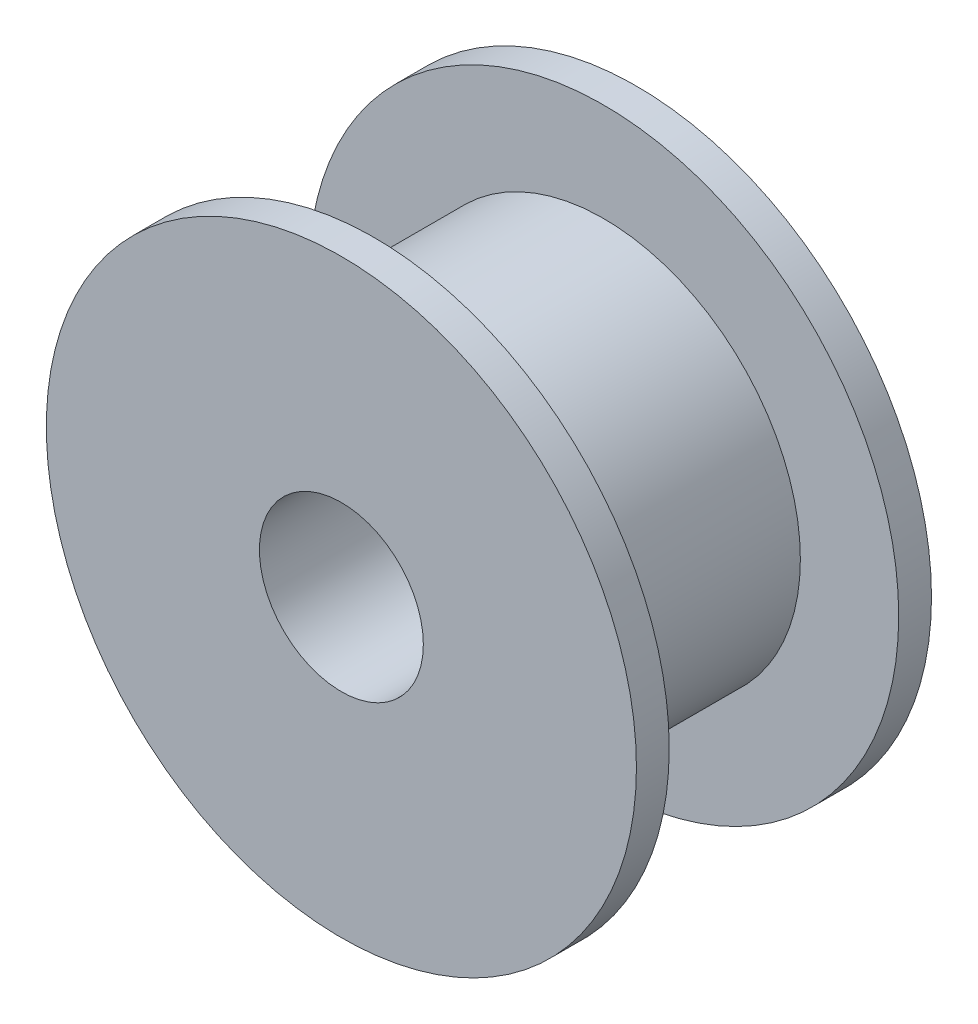
ISO-10303-21;
HEADER;
FILE_DESCRIPTION(('STEP AP214'),'2;1');
FILE_NAME('part.step','',(''),(''),'','','');
FILE_SCHEMA(('AUTOMOTIVE_DESIGN { 1 0 10303 214 1 1 1 1 }'));
ENDSEC;
DATA;
#1=APPLICATION_CONTEXT('core data for automotive mechanical design processes');
#2=APPLICATION_PROTOCOL_DEFINITION('international standard','automotive_design',2000,#1);
#3=PRODUCT_CONTEXT('',#1,'mechanical');
#4=PRODUCT('Part','Part','',(#3));
#5=PRODUCT_RELATED_PRODUCT_CATEGORY('part','',(#4));
#6=PRODUCT_DEFINITION_FORMATION('','',#4);
#7=PRODUCT_DEFINITION_CONTEXT('part definition',#1,'design');
#8=PRODUCT_DEFINITION('design','',#6,#7);
#9=PRODUCT_DEFINITION_SHAPE('','',#8);
#10=(LENGTH_UNIT() NAMED_UNIT(*) SI_UNIT(.MILLI.,.METRE.));
#11=(NAMED_UNIT(*) PLANE_ANGLE_UNIT() SI_UNIT($,.RADIAN.));
#12=(NAMED_UNIT(*) SI_UNIT($,.STERADIAN.) SOLID_ANGLE_UNIT());
#13=UNCERTAINTY_MEASURE_WITH_UNIT(LENGTH_MEASURE(1.E-05),#10,'distance_accuracy_value','');
#14=(GEOMETRIC_REPRESENTATION_CONTEXT(3) GLOBAL_UNCERTAINTY_ASSIGNED_CONTEXT((#13)) GLOBAL_UNIT_ASSIGNED_CONTEXT((#10,
#11,#12)) REPRESENTATION_CONTEXT('',''));
#15=CARTESIAN_POINT('',(0.,0.,0.));
#16=DIRECTION('',(0.,0.,1.));
#17=DIRECTION('',(1.,0.,0.));
#18=AXIS2_PLACEMENT_3D('',#15,#16,#17);
#19=CARTESIAN_POINT('',(0.,0.,1.));
#20=DIRECTION('',(0.,0.,-1.));
#21=DIRECTION('',(-1.,0.,0.));
#22=AXIS2_PLACEMENT_3D('',#19,#20,#21);
#23=CYLINDRICAL_SURFACE('',#22,9.);
#24=CARTESIAN_POINT('',(0.,0.,1.));
#25=DIRECTION('',(0.,0.,1.));
#26=DIRECTION('',(1.,0.,0.));
#27=AXIS2_PLACEMENT_3D('',#24,#25,#26);
#28=CIRCLE('',#27,9.);
#29=CARTESIAN_POINT('',(9.,0.,1.));
#30=VERTEX_POINT('',#29);
#31=EDGE_CURVE('E38',#30,#30,#28,.T.);
#32=ORIENTED_EDGE('',*,*,#31,.F.);
#33=EDGE_LOOP('',(#32));
#34=FACE_BOUND('',#33,.T.);
#35=CARTESIAN_POINT('',(0.,0.,0.));
#36=DIRECTION('',(0.,0.,1.));
#37=DIRECTION('',(1.,0.,0.));
#38=AXIS2_PLACEMENT_3D('',#35,#36,#37);
#39=CIRCLE('',#38,9.);
#40=CARTESIAN_POINT('',(9.,0.,0.));
#41=VERTEX_POINT('',#40);
#42=EDGE_CURVE('E34',#41,#41,#39,.T.);
#43=ORIENTED_EDGE('',*,*,#42,.T.);
#44=EDGE_LOOP('',(#43));
#45=FACE_BOUND('',#44,.T.);
#46=ADVANCED_FACE('F31',(#34,#45),#23,.T.);
#47=CARTESIAN_POINT('',(0.,0.,1.));
#48=DIRECTION('',(0.,0.,1.));
#49=DIRECTION('',(1.,0.,0.));
#50=AXIS2_PLACEMENT_3D('',#47,#48,#49);
#51=PLANE('',#50);
#52=CARTESIAN_POINT('',(0.,0.,1.));
#53=DIRECTION('',(0.,0.,1.));
#54=DIRECTION('',(1.,0.,0.));
#55=AXIS2_PLACEMENT_3D('',#52,#53,#54);
#56=CIRCLE('',#55,6.);
#57=CARTESIAN_POINT('',(6.,0.,1.));
#58=VERTEX_POINT('',#57);
#59=EDGE_CURVE('E10',#58,#58,#56,.T.);
#60=ORIENTED_EDGE('',*,*,#59,.F.);
#61=EDGE_LOOP('',(#60));
#62=FACE_BOUND('',#61,.T.);
#63=ORIENTED_EDGE('',*,*,#31,.T.);
#64=EDGE_LOOP('',(#63));
#65=FACE_BOUND('',#64,.T.);
#66=ADVANCED_FACE('F89',(#62,#65),#51,.T.);
#67=CARTESIAN_POINT('',(0.,0.,0.));
#68=DIRECTION('',(0.,0.,1.));
#69=DIRECTION('',(1.,0.,0.));
#70=AXIS2_PLACEMENT_3D('',#67,#68,#69);
#71=PLANE('',#70);
#72=CARTESIAN_POINT('',(0.,0.,0.));
#73=DIRECTION('',(0.,0.,1.));
#74=DIRECTION('',(1.,0.,0.));
#75=AXIS2_PLACEMENT_3D('',#72,#73,#74);
#76=CIRCLE('',#75,2.5);
#77=CARTESIAN_POINT('',(2.5,0.,0.));
#78=VERTEX_POINT('',#77);
#79=EDGE_CURVE('E51',#78,#78,#76,.T.);
#80=ORIENTED_EDGE('',*,*,#79,.T.);
#81=EDGE_LOOP('',(#80));
#82=FACE_BOUND('',#81,.T.);
#83=ORIENTED_EDGE('',*,*,#42,.F.);
#84=EDGE_LOOP('',(#83));
#85=FACE_BOUND('',#84,.T.);
#86=ADVANCED_FACE('F60',(#82,#85),#71,.F.);
#87=CARTESIAN_POINT('',(0.,0.,8.));
#88=DIRECTION('',(0.,0.,-1.));
#89=DIRECTION('',(-1.,0.,0.));
#90=AXIS2_PLACEMENT_3D('',#87,#88,#89);
#91=CYLINDRICAL_SURFACE('',#90,6.);
#92=CARTESIAN_POINT('',(0.,0.,8.));
#93=DIRECTION('',(0.,0.,1.));
#94=DIRECTION('',(1.,0.,0.));
#95=AXIS2_PLACEMENT_3D('',#92,#93,#94);
#96=CIRCLE('',#95,6.);
#97=CARTESIAN_POINT('',(6.,0.,8.));
#98=VERTEX_POINT('',#97);
#99=EDGE_CURVE('E44',#98,#98,#96,.T.);
#100=ORIENTED_EDGE('',*,*,#99,.F.);
#101=EDGE_LOOP('',(#100));
#102=FACE_BOUND('',#101,.T.);
#103=ORIENTED_EDGE('',*,*,#59,.T.);
#104=EDGE_LOOP('',(#103));
#105=FACE_BOUND('',#104,.T.);
#106=ADVANCED_FACE('F79',(#102,#105),#91,.T.);
#107=CARTESIAN_POINT('',(0.,0.,9.));
#108=DIRECTION('',(0.,0.,-1.));
#109=DIRECTION('',(-1.,0.,0.));
#110=AXIS2_PLACEMENT_3D('',#107,#108,#109);
#111=CYLINDRICAL_SURFACE('',#110,9.);
#112=CARTESIAN_POINT('',(0.,0.,9.));
#113=DIRECTION('',(0.,0.,1.));
#114=DIRECTION('',(1.,0.,0.));
#115=AXIS2_PLACEMENT_3D('',#112,#113,#114);
#116=CIRCLE('',#115,9.);
#117=CARTESIAN_POINT('',(9.,0.,9.));
#118=VERTEX_POINT('',#117);
#119=EDGE_CURVE('E47',#118,#118,#116,.T.);
#120=ORIENTED_EDGE('',*,*,#119,.F.);
#121=EDGE_LOOP('',(#120));
#122=FACE_BOUND('',#121,.T.);
#123=CARTESIAN_POINT('',(0.,0.,8.));
#124=DIRECTION('',(0.,0.,1.));
#125=DIRECTION('',(1.,0.,0.));
#126=AXIS2_PLACEMENT_3D('',#123,#124,#125);
#127=CIRCLE('',#126,9.);
#128=CARTESIAN_POINT('',(9.,0.,8.));
#129=VERTEX_POINT('',#128);
#130=EDGE_CURVE('E48',#129,#129,#127,.T.);
#131=ORIENTED_EDGE('',*,*,#130,.T.);
#132=EDGE_LOOP('',(#131));
#133=FACE_BOUND('',#132,.T.);
#134=ADVANCED_FACE('F73',(#122,#133),#111,.T.);
#135=CARTESIAN_POINT('',(0.,0.,9.));
#136=DIRECTION('',(0.,0.,1.));
#137=DIRECTION('',(1.,0.,0.));
#138=AXIS2_PLACEMENT_3D('',#135,#136,#137);
#139=PLANE('',#138);
#140=CARTESIAN_POINT('',(0.,0.,9.));
#141=DIRECTION('',(0.,0.,1.));
#142=DIRECTION('',(1.,0.,0.));
#143=AXIS2_PLACEMENT_3D('',#140,#141,#142);
#144=CIRCLE('',#143,2.5);
#145=CARTESIAN_POINT('',(2.5,0.,9.));
#146=VERTEX_POINT('',#145);
#147=EDGE_CURVE('E54',#146,#146,#144,.T.);
#148=ORIENTED_EDGE('',*,*,#147,.F.);
#149=EDGE_LOOP('',(#148));
#150=FACE_BOUND('',#149,.T.);
#151=ORIENTED_EDGE('',*,*,#119,.T.);
#152=EDGE_LOOP('',(#151));
#153=FACE_BOUND('',#152,.T.);
#154=ADVANCED_FACE('F70',(#150,#153),#139,.T.);
#155=CARTESIAN_POINT('',(0.,0.,8.));
#156=DIRECTION('',(0.,0.,1.));
#157=DIRECTION('',(1.,0.,0.));
#158=AXIS2_PLACEMENT_3D('',#155,#156,#157);
#159=PLANE('',#158);
#160=ORIENTED_EDGE('',*,*,#99,.T.);
#161=EDGE_LOOP('',(#160));
#162=FACE_BOUND('',#161,.T.);
#163=ORIENTED_EDGE('',*,*,#130,.F.);
#164=EDGE_LOOP('',(#163));
#165=FACE_BOUND('',#164,.T.);
#166=ADVANCED_FACE('F66',(#162,#165),#159,.F.);
#167=CARTESIAN_POINT('',(0.,0.,0.));
#168=DIRECTION('',(0.,0.,1.));
#169=DIRECTION('',(1.,0.,0.));
#170=AXIS2_PLACEMENT_3D('',#167,#168,#169);
#171=CYLINDRICAL_SURFACE('',#170,2.5);
#172=ORIENTED_EDGE('',*,*,#79,.F.);
#173=EDGE_LOOP('',(#172));
#174=FACE_BOUND('',#173,.T.);
#175=ORIENTED_EDGE('',*,*,#147,.T.);
#176=EDGE_LOOP('',(#175));
#177=FACE_BOUND('',#176,.T.);
#178=ADVANCED_FACE('F63',(#174,#177),#171,.F.);
#179=CLOSED_SHELL('',(#46,#66,#86,#106,#134,#154,#166,#178));
#180=MANIFOLD_SOLID_BREP('B2',#179);
#181=ADVANCED_BREP_SHAPE_REPRESENTATION('',(#18,#180),#14);
#182=SHAPE_DEFINITION_REPRESENTATION(#9,#181);
ENDSEC;
END-ISO-10303-21;
